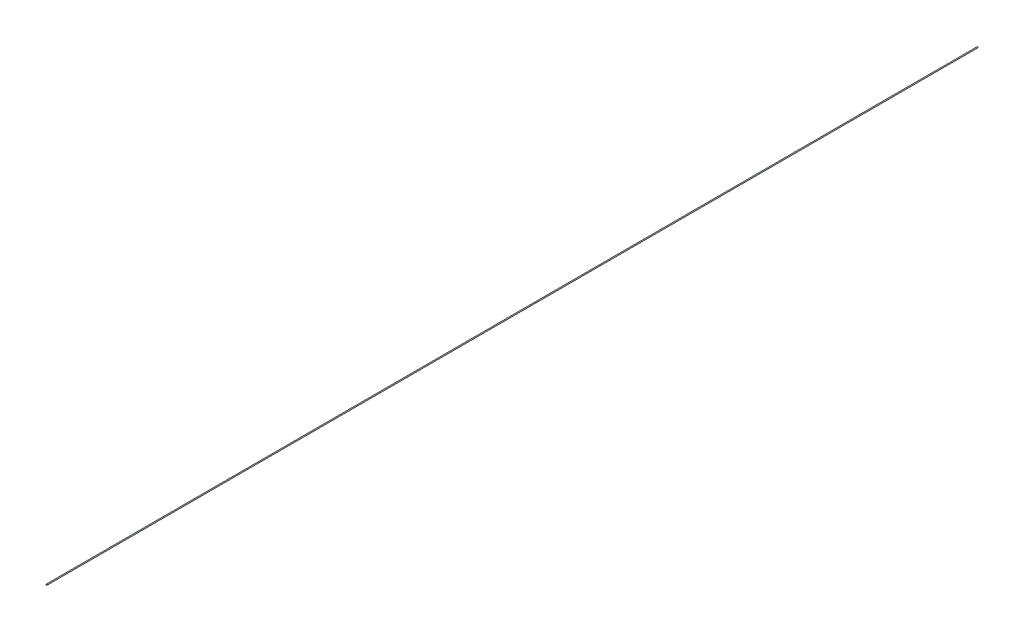
ISO-10303-21;
HEADER;
FILE_DESCRIPTION(('STEP AP214'),'2;1');
FILE_NAME('part.step','',(''),(''),'','','');
FILE_SCHEMA(('AUTOMOTIVE_DESIGN { 1 0 10303 214 1 1 1 1 }'));
ENDSEC;
DATA;
#1=APPLICATION_CONTEXT('core data for automotive mechanical design processes');
#2=APPLICATION_PROTOCOL_DEFINITION('international standard','automotive_design',2000,#1);
#3=PRODUCT_CONTEXT('',#1,'mechanical');
#4=PRODUCT('Part','Part','',(#3));
#5=PRODUCT_RELATED_PRODUCT_CATEGORY('part','',(#4));
#6=PRODUCT_DEFINITION_FORMATION('','',#4);
#7=PRODUCT_DEFINITION_CONTEXT('part definition',#1,'design');
#8=PRODUCT_DEFINITION('design','',#6,#7);
#9=PRODUCT_DEFINITION_SHAPE('','',#8);
#10=(LENGTH_UNIT() NAMED_UNIT(*) SI_UNIT(.MILLI.,.METRE.));
#11=(NAMED_UNIT(*) PLANE_ANGLE_UNIT() SI_UNIT($,.RADIAN.));
#12=(NAMED_UNIT(*) SI_UNIT($,.STERADIAN.) SOLID_ANGLE_UNIT());
#13=UNCERTAINTY_MEASURE_WITH_UNIT(LENGTH_MEASURE(1.E-05),#10,'distance_accuracy_value','');
#14=(GEOMETRIC_REPRESENTATION_CONTEXT(3) GLOBAL_UNCERTAINTY_ASSIGNED_CONTEXT((#13)) GLOBAL_UNIT_ASSIGNED_CONTEXT((#10,
#11,#12)) REPRESENTATION_CONTEXT('',''));
#15=CARTESIAN_POINT('',(0.,0.,0.));
#16=DIRECTION('',(0.,0.,1.));
#17=DIRECTION('',(1.,0.,0.));
#18=AXIS2_PLACEMENT_3D('',#15,#16,#17);
#19=CARTESIAN_POINT('',(0.,0.,7620.));
#20=DIRECTION('',(0.,0.,-1.));
#21=DIRECTION('',(-1.,0.,0.));
#22=AXIS2_PLACEMENT_3D('',#19,#20,#21);
#23=CYLINDRICAL_SURFACE('',#22,4.);
#24=CARTESIAN_POINT('',(0.,0.,7617.));
#25=DIRECTION('',(0.,0.,1.));
#26=DIRECTION('',(1.,0.,0.));
#27=AXIS2_PLACEMENT_3D('',#24,#25,#26);
#28=CIRCLE('',#27,4.);
#29=CARTESIAN_POINT('',(4.,0.,7617.));
#30=VERTEX_POINT('',#29);
#31=EDGE_CURVE('E40',#30,#30,#28,.F.);
#32=ORIENTED_EDGE('',*,*,#31,.T.);
#33=EDGE_LOOP('',(#32));
#34=FACE_BOUND('',#33,.T.);
#35=CARTESIAN_POINT('',(0.,0.,3.00000000000011));
#36=DIRECTION('',(0.,0.,1.));
#37=DIRECTION('',(1.,0.,0.));
#38=AXIS2_PLACEMENT_3D('',#35,#36,#37);
#39=CIRCLE('',#38,4.);
#40=CARTESIAN_POINT('',(4.,0.,3.00000000000011));
#41=VERTEX_POINT('',#40);
#42=EDGE_CURVE('E45',#41,#41,#39,.T.);
#43=ORIENTED_EDGE('',*,*,#42,.T.);
#44=EDGE_LOOP('',(#43));
#45=FACE_BOUND('',#44,.T.);
#46=ADVANCED_FACE('F33',(#34,#45),#23,.T.);
#47=CARTESIAN_POINT('',(0.,0.,7620.));
#48=DIRECTION('',(0.,0.,1.));
#49=DIRECTION('',(1.,0.,0.));
#50=AXIS2_PLACEMENT_3D('',#47,#48,#49);
#51=PLANE('',#50);
#52=CARTESIAN_POINT('',(0.,0.,7620.));
#53=DIRECTION('',(0.,0.,1.));
#54=DIRECTION('',(1.,0.,0.));
#55=AXIS2_PLACEMENT_3D('',#52,#53,#54);
#56=CIRCLE('',#55,1.);
#57=CARTESIAN_POINT('',(1.,0.,7620.));
#58=VERTEX_POINT('',#57);
#59=EDGE_CURVE('E50',#58,#58,#56,.T.);
#60=ORIENTED_EDGE('',*,*,#59,.T.);
#61=EDGE_LOOP('',(#60));
#62=FACE_BOUND('',#61,.T.);
#63=ADVANCED_FACE('F56',(#62),#51,.T.);
#64=CARTESIAN_POINT('',(0.,0.,0.));
#65=DIRECTION('',(0.,0.,1.));
#66=DIRECTION('',(1.,0.,0.));
#67=AXIS2_PLACEMENT_3D('',#64,#65,#66);
#68=PLANE('',#67);
#69=CARTESIAN_POINT('',(0.,0.,0.));
#70=DIRECTION('',(0.,0.,1.));
#71=DIRECTION('',(1.,0.,0.));
#72=AXIS2_PLACEMENT_3D('',#69,#70,#71);
#73=CIRCLE('',#72,1.);
#74=CARTESIAN_POINT('',(1.,0.,0.));
#75=VERTEX_POINT('',#74);
#76=EDGE_CURVE('E10',#75,#75,#73,.F.);
#77=ORIENTED_EDGE('',*,*,#76,.T.);
#78=EDGE_LOOP('',(#77));
#79=FACE_BOUND('',#78,.T.);
#80=ADVANCED_FACE('F60',(#79),#68,.F.);
#81=CARTESIAN_POINT('',(0.,0.,7617.));
#82=DIRECTION('',(0.,0.,1.));
#83=DIRECTION('',(1.,0.,0.));
#84=AXIS2_PLACEMENT_3D('',#81,#82,#83);
#85=DEGENERATE_TOROIDAL_SURFACE('',#84,1.,3.,.T.);
#86=ORIENTED_EDGE('',*,*,#31,.F.);
#87=EDGE_LOOP('',(#86));
#88=FACE_BOUND('',#87,.T.);
#89=ORIENTED_EDGE('',*,*,#59,.F.);
#90=EDGE_LOOP('',(#89));
#91=FACE_BOUND('',#90,.T.);
#92=ADVANCED_FACE('F58',(#88,#91),#85,.T.);
#93=CARTESIAN_POINT('',(0.,0.,3.00000000000011));
#94=DIRECTION('',(0.,0.,1.));
#95=DIRECTION('',(1.,0.,0.));
#96=AXIS2_PLACEMENT_3D('',#93,#94,#95);
#97=DEGENERATE_TOROIDAL_SURFACE('',#96,1.,3.,.T.);
#98=ORIENTED_EDGE('',*,*,#76,.F.);
#99=EDGE_LOOP('',(#98));
#100=FACE_BOUND('',#99,.T.);
#101=ORIENTED_EDGE('',*,*,#42,.F.);
#102=EDGE_LOOP('',(#101));
#103=FACE_BOUND('',#102,.T.);
#104=ADVANCED_FACE('F35',(#100,#103),#97,.T.);
#105=CLOSED_SHELL('',(#46,#63,#80,#92,#104));
#106=MANIFOLD_SOLID_BREP('B2',#105);
#107=ADVANCED_BREP_SHAPE_REPRESENTATION('',(#18,#106),#14);
#108=SHAPE_DEFINITION_REPRESENTATION(#9,#107);
ENDSEC;
END-ISO-10303-21;
